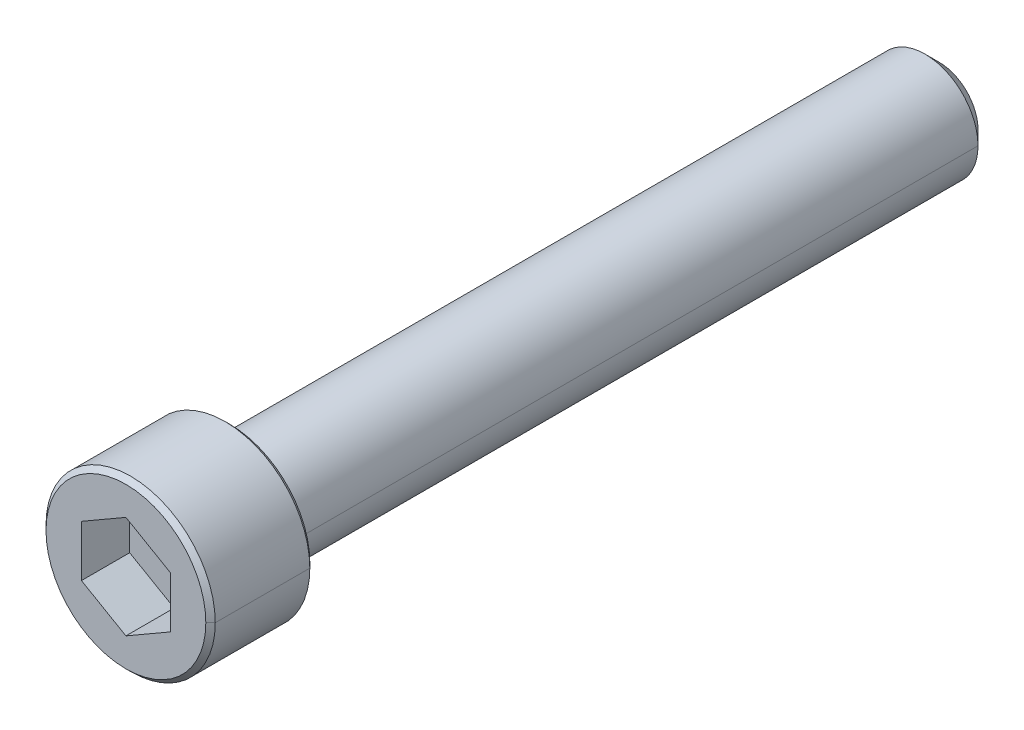
ISO-10303-21;
HEADER;
FILE_DESCRIPTION(('STEP AP214'),'2;1');
FILE_NAME('part.step','',(''),(''),'','','');
FILE_SCHEMA(('AUTOMOTIVE_DESIGN { 1 0 10303 214 1 1 1 1 }'));
ENDSEC;
DATA;
#1=APPLICATION_CONTEXT('core data for automotive mechanical design processes');
#2=APPLICATION_PROTOCOL_DEFINITION('international standard','automotive_design',2000,#1);
#3=PRODUCT_CONTEXT('',#1,'mechanical');
#4=PRODUCT('Part','Part','',(#3));
#5=PRODUCT_RELATED_PRODUCT_CATEGORY('part','',(#4));
#6=PRODUCT_DEFINITION_FORMATION('','',#4);
#7=PRODUCT_DEFINITION_CONTEXT('part definition',#1,'design');
#8=PRODUCT_DEFINITION('design','',#6,#7);
#9=PRODUCT_DEFINITION_SHAPE('','',#8);
#10=(LENGTH_UNIT() NAMED_UNIT(*) SI_UNIT(.MILLI.,.METRE.));
#11=(NAMED_UNIT(*) PLANE_ANGLE_UNIT() SI_UNIT($,.RADIAN.));
#12=(NAMED_UNIT(*) SI_UNIT($,.STERADIAN.) SOLID_ANGLE_UNIT());
#13=UNCERTAINTY_MEASURE_WITH_UNIT(LENGTH_MEASURE(1.E-05),#10,'distance_accuracy_value','');
#14=(GEOMETRIC_REPRESENTATION_CONTEXT(3) GLOBAL_UNCERTAINTY_ASSIGNED_CONTEXT((#13)) GLOBAL_UNIT_ASSIGNED_CONTEXT((#10,
#11,#12)) REPRESENTATION_CONTEXT('',''));
#15=CARTESIAN_POINT('',(0.,0.,0.));
#16=DIRECTION('',(0.,0.,1.));
#17=DIRECTION('',(1.,0.,0.));
#18=AXIS2_PLACEMENT_3D('',#15,#16,#17);
#19=CARTESIAN_POINT('',(0.,0.,0.));
#20=DIRECTION('',(0.,0.,-1.));
#21=DIRECTION('',(-1.,0.,0.));
#22=AXIS2_PLACEMENT_3D('',#19,#20,#21);
#23=PLANE('',#22);
#24=CARTESIAN_POINT('',(0.,0.,0.));
#25=DIRECTION('',(0.,0.,-1.));
#26=DIRECTION('',(-1.,0.,0.));
#27=AXIS2_PLACEMENT_3D('',#24,#25,#26);
#28=CIRCLE('',#27,2.1463);
#29=CARTESIAN_POINT('',(2.1463,0.,0.));
#30=VERTEX_POINT('',#29);
#31=CARTESIAN_POINT('',(-2.1463,0.,0.));
#32=VERTEX_POINT('',#31);
#33=EDGE_CURVE('E11',#30,#32,#28,.T.);
#34=ORIENTED_EDGE('',*,*,#33,.F.);
#35=CARTESIAN_POINT('',(0.,0.,0.));
#36=DIRECTION('',(0.,0.,-1.));
#37=DIRECTION('',(-1.,0.,0.));
#38=AXIS2_PLACEMENT_3D('',#35,#36,#37);
#39=CIRCLE('',#38,2.1463);
#40=EDGE_CURVE('E24',#32,#30,#39,.T.);
#41=ORIENTED_EDGE('',*,*,#40,.F.);
#42=EDGE_LOOP('',(#34,#41));
#43=FACE_BOUND('',#42,.T.);
#44=DIRECTION('',(0.866025403784434,-0.500000000000008,0.));
#45=VECTOR('',#44,1.);
#46=CARTESIAN_POINT('',(-1.1938,-0.689240751358565,0.));
#47=LINE('',#46,#45);
#48=CARTESIAN_POINT('',(-1.1938,-0.689240751358565,0.));
#49=VERTEX_POINT('',#48);
#50=CARTESIAN_POINT('',(0.,-1.37848150271715,0.));
#51=VERTEX_POINT('',#50);
#52=EDGE_CURVE('E303',#49,#51,#47,.T.);
#53=ORIENTED_EDGE('',*,*,#52,.F.);
#54=DIRECTION('',(0.,-1.,0.));
#55=VECTOR('',#54,1.);
#56=CARTESIAN_POINT('',(-1.1938,0.689240751358565,0.));
#57=LINE('',#56,#55);
#58=CARTESIAN_POINT('',(-1.1938,0.689240751358565,0.));
#59=VERTEX_POINT('',#58);
#60=EDGE_CURVE('E298',#59,#49,#57,.T.);
#61=ORIENTED_EDGE('',*,*,#60,.F.);
#62=DIRECTION('',(-0.866025403784434,-0.500000000000008,0.));
#63=VECTOR('',#62,1.);
#64=CARTESIAN_POINT('',(0.,1.37848150271715,0.));
#65=LINE('',#64,#63);
#66=CARTESIAN_POINT('',(0.,1.37848150271715,0.));
#67=VERTEX_POINT('',#66);
#68=EDGE_CURVE('E293',#67,#59,#65,.T.);
#69=ORIENTED_EDGE('',*,*,#68,.F.);
#70=DIRECTION('',(-0.866025403784434,0.500000000000008,0.));
#71=VECTOR('',#70,1.);
#72=CARTESIAN_POINT('',(1.1938,0.689240751358565,0.));
#73=LINE('',#72,#71);
#74=CARTESIAN_POINT('',(1.1938,0.689240751358565,0.));
#75=VERTEX_POINT('',#74);
#76=EDGE_CURVE('E288',#75,#67,#73,.T.);
#77=ORIENTED_EDGE('',*,*,#76,.F.);
#78=DIRECTION('',(0.,1.,0.));
#79=VECTOR('',#78,1.);
#80=CARTESIAN_POINT('',(1.1938,-0.689240751358565,0.));
#81=LINE('',#80,#79);
#82=CARTESIAN_POINT('',(1.1938,-0.689240751358565,0.));
#83=VERTEX_POINT('',#82);
#84=EDGE_CURVE('E283',#83,#75,#81,.T.);
#85=ORIENTED_EDGE('',*,*,#84,.F.);
#86=DIRECTION('',(0.866025403784434,0.500000000000008,0.));
#87=VECTOR('',#86,1.);
#88=CARTESIAN_POINT('',(0.,-1.37848150271715,0.));
#89=LINE('',#88,#87);
#90=EDGE_CURVE('E278',#51,#83,#89,.T.);
#91=ORIENTED_EDGE('',*,*,#90,.F.);
#92=EDGE_LOOP('',(#53,#61,#69,#77,#85,#91));
#93=FACE_BOUND('',#92,.T.);
#94=ADVANCED_FACE('F16',(#43,#93),#23,.F.);
#95=CARTESIAN_POINT('',(0.,-1.37848150271715,-1.2954));
#96=DIRECTION('',(0.500000000000008,-0.866025403784434,0.));
#97=DIRECTION('',(0.866025403784434,0.500000000000008,0.));
#98=AXIS2_PLACEMENT_3D('',#95,#96,#97);
#99=PLANE('',#98);
#100=ORIENTED_EDGE('',*,*,#90,.T.);
#101=DIRECTION('',(0.,0.,1.));
#102=VECTOR('',#101,1.);
#103=CARTESIAN_POINT('',(1.1938,-0.689240751358565,-1.2954));
#104=LINE('',#103,#102);
#105=CARTESIAN_POINT('',(1.1938,-0.689240751358565,-1.2954));
#106=VERTEX_POINT('',#105);
#107=EDGE_CURVE('E273',#106,#83,#104,.T.);
#108=ORIENTED_EDGE('',*,*,#107,.F.);
#109=DIRECTION('',(0.866025403784434,0.500000000000008,0.));
#110=VECTOR('',#109,1.);
#111=CARTESIAN_POINT('',(0.,-1.37848150271715,-1.2954));
#112=LINE('',#111,#110);
#113=CARTESIAN_POINT('',(0.,-1.37848150271715,-1.2954));
#114=VERTEX_POINT('',#113);
#115=EDGE_CURVE('E268',#114,#106,#112,.T.);
#116=ORIENTED_EDGE('',*,*,#115,.F.);
#117=DIRECTION('',(0.,0.,1.));
#118=VECTOR('',#117,1.);
#119=CARTESIAN_POINT('',(0.,-1.37848150271715,-1.2954));
#120=LINE('',#119,#118);
#121=EDGE_CURVE('E263',#114,#51,#120,.T.);
#122=ORIENTED_EDGE('',*,*,#121,.T.);
#123=EDGE_LOOP('',(#100,#108,#116,#122));
#124=FACE_BOUND('',#123,.T.);
#125=ADVANCED_FACE('F346',(#124),#99,.F.);
#126=CARTESIAN_POINT('',(-1.1938,-0.689240751358565,-1.2954));
#127=DIRECTION('',(-0.500000000000008,-0.866025403784434,0.));
#128=DIRECTION('',(0.866025403784434,-0.500000000000008,0.));
#129=AXIS2_PLACEMENT_3D('',#126,#127,#128);
#130=PLANE('',#129);
#131=ORIENTED_EDGE('',*,*,#52,.T.);
#132=ORIENTED_EDGE('',*,*,#121,.F.);
#133=DIRECTION('',(0.866025403784434,-0.500000000000008,0.));
#134=VECTOR('',#133,1.);
#135=CARTESIAN_POINT('',(-1.1938,-0.689240751358565,-1.2954));
#136=LINE('',#135,#134);
#137=CARTESIAN_POINT('',(-1.1938,-0.689240751358565,-1.2954));
#138=VERTEX_POINT('',#137);
#139=EDGE_CURVE('E258',#138,#114,#136,.T.);
#140=ORIENTED_EDGE('',*,*,#139,.F.);
#141=DIRECTION('',(0.,0.,1.));
#142=VECTOR('',#141,1.);
#143=CARTESIAN_POINT('',(-1.1938,-0.689240751358565,-1.2954));
#144=LINE('',#143,#142);
#145=EDGE_CURVE('E253',#138,#49,#144,.T.);
#146=ORIENTED_EDGE('',*,*,#145,.T.);
#147=EDGE_LOOP('',(#131,#132,#140,#146));
#148=FACE_BOUND('',#147,.T.);
#149=ADVANCED_FACE('F350',(#148),#130,.F.);
#150=CARTESIAN_POINT('',(-1.1938,0.689240751358565,-1.2954));
#151=DIRECTION('',(-1.,0.,0.));
#152=DIRECTION('',(0.,0.,1.));
#153=AXIS2_PLACEMENT_3D('',#150,#151,#152);
#154=PLANE('',#153);
#155=ORIENTED_EDGE('',*,*,#60,.T.);
#156=ORIENTED_EDGE('',*,*,#145,.F.);
#157=DIRECTION('',(0.,-1.,0.));
#158=VECTOR('',#157,1.);
#159=CARTESIAN_POINT('',(-1.1938,0.689240751358565,-1.2954));
#160=LINE('',#159,#158);
#161=CARTESIAN_POINT('',(-1.1938,0.689240751358565,-1.2954));
#162=VERTEX_POINT('',#161);
#163=EDGE_CURVE('E248',#162,#138,#160,.T.);
#164=ORIENTED_EDGE('',*,*,#163,.F.);
#165=DIRECTION('',(0.,0.,1.));
#166=VECTOR('',#165,1.);
#167=CARTESIAN_POINT('',(-1.1938,0.689240751358565,-1.2954));
#168=LINE('',#167,#166);
#169=EDGE_CURVE('E243',#162,#59,#168,.T.);
#170=ORIENTED_EDGE('',*,*,#169,.T.);
#171=EDGE_LOOP('',(#155,#156,#164,#170));
#172=FACE_BOUND('',#171,.T.);
#173=ADVANCED_FACE('F357',(#172),#154,.F.);
#174=CARTESIAN_POINT('',(0.,1.37848150271715,-1.2954));
#175=DIRECTION('',(-0.500000000000008,0.866025403784434,0.));
#176=DIRECTION('',(-0.866025403784434,-0.500000000000008,0.));
#177=AXIS2_PLACEMENT_3D('',#174,#175,#176);
#178=PLANE('',#177);
#179=ORIENTED_EDGE('',*,*,#68,.T.);
#180=ORIENTED_EDGE('',*,*,#169,.F.);
#181=DIRECTION('',(-0.866025403784434,-0.500000000000008,0.));
#182=VECTOR('',#181,1.);
#183=CARTESIAN_POINT('',(0.,1.37848150271715,-1.2954));
#184=LINE('',#183,#182);
#185=CARTESIAN_POINT('',(0.,1.37848150271715,-1.2954));
#186=VERTEX_POINT('',#185);
#187=EDGE_CURVE('E238',#186,#162,#184,.T.);
#188=ORIENTED_EDGE('',*,*,#187,.F.);
#189=DIRECTION('',(0.,0.,1.));
#190=VECTOR('',#189,1.);
#191=CARTESIAN_POINT('',(0.,1.37848150271715,-1.2954));
#192=LINE('',#191,#190);
#193=EDGE_CURVE('E233',#186,#67,#192,.T.);
#194=ORIENTED_EDGE('',*,*,#193,.T.);
#195=EDGE_LOOP('',(#179,#180,#188,#194));
#196=FACE_BOUND('',#195,.T.);
#197=ADVANCED_FACE('F360',(#196),#178,.F.);
#198=CARTESIAN_POINT('',(1.1938,0.689240751358565,-1.2954));
#199=DIRECTION('',(0.500000000000008,0.866025403784434,0.));
#200=DIRECTION('',(-0.866025403784434,0.500000000000008,0.));
#201=AXIS2_PLACEMENT_3D('',#198,#199,#200);
#202=PLANE('',#201);
#203=ORIENTED_EDGE('',*,*,#76,.T.);
#204=ORIENTED_EDGE('',*,*,#193,.F.);
#205=DIRECTION('',(-0.866025403784434,0.500000000000008,0.));
#206=VECTOR('',#205,1.);
#207=CARTESIAN_POINT('',(1.1938,0.689240751358565,-1.2954));
#208=LINE('',#207,#206);
#209=CARTESIAN_POINT('',(1.1938,0.689240751358565,-1.2954));
#210=VERTEX_POINT('',#209);
#211=EDGE_CURVE('E228',#210,#186,#208,.T.);
#212=ORIENTED_EDGE('',*,*,#211,.F.);
#213=DIRECTION('',(0.,0.,1.));
#214=VECTOR('',#213,1.);
#215=CARTESIAN_POINT('',(1.1938,0.689240751358565,-1.2954));
#216=LINE('',#215,#214);
#217=EDGE_CURVE('E223',#210,#75,#216,.T.);
#218=ORIENTED_EDGE('',*,*,#217,.T.);
#219=EDGE_LOOP('',(#203,#204,#212,#218));
#220=FACE_BOUND('',#219,.T.);
#221=ADVANCED_FACE('F364',(#220),#202,.F.);
#222=CARTESIAN_POINT('',(1.1938,-0.689240751358565,-1.2954));
#223=DIRECTION('',(1.,0.,0.));
#224=DIRECTION('',(0.,0.,-1.));
#225=AXIS2_PLACEMENT_3D('',#222,#223,#224);
#226=PLANE('',#225);
#227=ORIENTED_EDGE('',*,*,#84,.T.);
#228=ORIENTED_EDGE('',*,*,#217,.F.);
#229=DIRECTION('',(0.,1.,0.));
#230=VECTOR('',#229,1.);
#231=CARTESIAN_POINT('',(1.1938,-0.689240751358565,-1.2954));
#232=LINE('',#231,#230);
#233=EDGE_CURVE('E218',#106,#210,#232,.T.);
#234=ORIENTED_EDGE('',*,*,#233,.F.);
#235=ORIENTED_EDGE('',*,*,#107,.T.);
#236=EDGE_LOOP('',(#227,#228,#234,#235));
#237=FACE_BOUND('',#236,.T.);
#238=ADVANCED_FACE('F367',(#237),#226,.F.);
#239=CARTESIAN_POINT('',(0.,0.,-1.2954));
#240=DIRECTION('',(0.,0.,1.));
#241=DIRECTION('',(1.,0.,0.));
#242=AXIS2_PLACEMENT_3D('',#239,#240,#241);
#243=PLANE('',#242);
#244=ORIENTED_EDGE('',*,*,#163,.T.);
#245=ORIENTED_EDGE('',*,*,#139,.T.);
#246=ORIENTED_EDGE('',*,*,#115,.T.);
#247=ORIENTED_EDGE('',*,*,#233,.T.);
#248=ORIENTED_EDGE('',*,*,#211,.T.);
#249=ORIENTED_EDGE('',*,*,#187,.T.);
#250=EDGE_LOOP('',(#244,#245,#246,#247,#248,#249));
#251=FACE_BOUND('',#250,.T.);
#252=ADVANCED_FACE('F369',(#251),#243,.T.);
#253=CARTESIAN_POINT('',(0.,0.,0.));
#254=DIRECTION('',(0.,0.,-1.));
#255=DIRECTION('',(0.,-1.,0.));
#256=AXIS2_PLACEMENT_3D('',#253,#254,#255);
#257=CONICAL_SURFACE('',#256,2.1463,0.785398163397453);
#258=DIRECTION('',(0.707106781186551,0.,-0.707106781186544));
#259=VECTOR('',#258,1.);
#260=CARTESIAN_POINT('',(2.1463,0.,0.));
#261=LINE('',#260,#259);
#262=CARTESIAN_POINT('',(2.2733,0.,-0.126999999999998));
#263=VERTEX_POINT('',#262);
#264=EDGE_CURVE('E214',#30,#263,#261,.T.);
#265=ORIENTED_EDGE('',*,*,#264,.T.);
#266=CARTESIAN_POINT('',(0.,0.,-0.126999999999999));
#267=DIRECTION('',(0.,0.,-1.));
#268=DIRECTION('',(-1.,0.,0.));
#269=AXIS2_PLACEMENT_3D('',#266,#267,#268);
#270=CIRCLE('',#269,2.2733);
#271=CARTESIAN_POINT('',(-2.2733,0.,-0.126999999999999));
#272=VERTEX_POINT('',#271);
#273=EDGE_CURVE('E209',#272,#263,#270,.T.);
#274=ORIENTED_EDGE('',*,*,#273,.F.);
#275=DIRECTION('',(-0.707106781186551,0.,-0.707106781186544));
#276=VECTOR('',#275,1.);
#277=CARTESIAN_POINT('',(-2.1463,0.,0.));
#278=LINE('',#277,#276);
#279=EDGE_CURVE('E204',#32,#272,#278,.T.);
#280=ORIENTED_EDGE('',*,*,#279,.F.);
#281=ORIENTED_EDGE('',*,*,#40,.T.);
#282=EDGE_LOOP('',(#265,#274,#280,#281));
#283=FACE_BOUND('',#282,.T.);
#284=ADVANCED_FACE('F313',(#283),#257,.T.);
#285=CARTESIAN_POINT('',(0.,0.,0.));
#286=DIRECTION('',(0.,0.,-1.));
#287=DIRECTION('',(0.,1.,0.));
#288=AXIS2_PLACEMENT_3D('',#285,#286,#287);
#289=CONICAL_SURFACE('',#288,2.1463,0.785398163397453);
#290=ORIENTED_EDGE('',*,*,#264,.F.);
#291=ORIENTED_EDGE('',*,*,#33,.T.);
#292=ORIENTED_EDGE('',*,*,#279,.T.);
#293=CARTESIAN_POINT('',(0.,0.,-0.126999999999999));
#294=DIRECTION('',(0.,0.,-1.));
#295=DIRECTION('',(-1.,0.,0.));
#296=AXIS2_PLACEMENT_3D('',#293,#294,#295);
#297=CIRCLE('',#296,2.2733);
#298=EDGE_CURVE('E199',#263,#272,#297,.T.);
#299=ORIENTED_EDGE('',*,*,#298,.F.);
#300=EDGE_LOOP('',(#290,#291,#292,#299));
#301=FACE_BOUND('',#300,.T.);
#302=ADVANCED_FACE('F316',(#301),#289,.T.);
#303=CARTESIAN_POINT('',(0.,0.,-21.844));
#304=DIRECTION('',(0.,0.,-1.));
#305=DIRECTION('',(0.,1.,0.));
#306=AXIS2_PLACEMENT_3D('',#303,#304,#305);
#307=CYLINDRICAL_SURFACE('',#306,2.2733);
#308=DIRECTION('',(0.,0.,-1.));
#309=VECTOR('',#308,1.);
#310=CARTESIAN_POINT('',(2.2733,0.,-0.126999999999999));
#311=LINE('',#310,#309);
#312=CARTESIAN_POINT('',(2.2733,0.,-2.667));
#313=VERTEX_POINT('',#312);
#314=EDGE_CURVE('E194',#263,#313,#311,.T.);
#315=ORIENTED_EDGE('',*,*,#314,.F.);
#316=ORIENTED_EDGE('',*,*,#298,.T.);
#317=DIRECTION('',(0.,0.,-1.));
#318=VECTOR('',#317,1.);
#319=CARTESIAN_POINT('',(-2.2733,0.,-0.126999999999999));
#320=LINE('',#319,#318);
#321=CARTESIAN_POINT('',(-2.2733,0.,-2.667));
#322=VERTEX_POINT('',#321);
#323=EDGE_CURVE('E190',#272,#322,#320,.T.);
#324=ORIENTED_EDGE('',*,*,#323,.T.);
#325=CARTESIAN_POINT('',(0.,0.,-2.667));
#326=DIRECTION('',(0.,0.,-1.));
#327=DIRECTION('',(-1.,0.,0.));
#328=AXIS2_PLACEMENT_3D('',#325,#326,#327);
#329=CIRCLE('',#328,2.2733);
#330=EDGE_CURVE('E185',#313,#322,#329,.T.);
#331=ORIENTED_EDGE('',*,*,#330,.F.);
#332=EDGE_LOOP('',(#315,#316,#324,#331));
#333=FACE_BOUND('',#332,.T.);
#334=ADVANCED_FACE('F320',(#333),#307,.T.);
#335=CARTESIAN_POINT('',(0.,0.,-2.667));
#336=DIRECTION('',(0.,0.,1.));
#337=DIRECTION('',(0.,1.,0.));
#338=AXIS2_PLACEMENT_3D('',#335,#336,#337);
#339=CONICAL_SURFACE('',#338,2.2733,0.78539816339744);
#340=DIRECTION('',(-0.707106781186541,0.,0.707106781186554));
#341=VECTOR('',#340,1.);
#342=CARTESIAN_POINT('',(-2.1463,0.,-2.794));
#343=LINE('',#342,#341);
#344=CARTESIAN_POINT('',(-2.1463,0.,-2.794));
#345=VERTEX_POINT('',#344);
#346=EDGE_CURVE('E180',#345,#322,#343,.T.);
#347=ORIENTED_EDGE('',*,*,#346,.F.);
#348=CARTESIAN_POINT('',(0.,0.,-2.794));
#349=DIRECTION('',(0.,0.,-1.));
#350=DIRECTION('',(-1.,0.,0.));
#351=AXIS2_PLACEMENT_3D('',#348,#349,#350);
#352=CIRCLE('',#351,2.1463);
#353=CARTESIAN_POINT('',(2.1463,0.,-2.794));
#354=VERTEX_POINT('',#353);
#355=EDGE_CURVE('E175',#354,#345,#352,.T.);
#356=ORIENTED_EDGE('',*,*,#355,.F.);
#357=DIRECTION('',(0.707106781186541,0.,0.707106781186554));
#358=VECTOR('',#357,1.);
#359=CARTESIAN_POINT('',(2.1463,0.,-2.794));
#360=LINE('',#359,#358);
#361=EDGE_CURVE('E170',#354,#313,#360,.T.);
#362=ORIENTED_EDGE('',*,*,#361,.T.);
#363=ORIENTED_EDGE('',*,*,#330,.T.);
#364=EDGE_LOOP('',(#347,#356,#362,#363));
#365=FACE_BOUND('',#364,.T.);
#366=ADVANCED_FACE('F329',(#365),#339,.T.);
#367=CARTESIAN_POINT('',(0.,0.,-2.667));
#368=DIRECTION('',(0.,0.,1.));
#369=DIRECTION('',(0.,-1.,0.));
#370=AXIS2_PLACEMENT_3D('',#367,#368,#369);
#371=CONICAL_SURFACE('',#370,2.2733,0.78539816339744);
#372=ORIENTED_EDGE('',*,*,#346,.T.);
#373=CARTESIAN_POINT('',(0.,0.,-2.667));
#374=DIRECTION('',(0.,0.,-1.));
#375=DIRECTION('',(-1.,0.,0.));
#376=AXIS2_PLACEMENT_3D('',#373,#374,#375);
#377=CIRCLE('',#376,2.2733);
#378=EDGE_CURVE('E165',#322,#313,#377,.T.);
#379=ORIENTED_EDGE('',*,*,#378,.T.);
#380=ORIENTED_EDGE('',*,*,#361,.F.);
#381=CARTESIAN_POINT('',(0.,0.,-2.794));
#382=DIRECTION('',(0.,0.,-1.));
#383=DIRECTION('',(-1.,0.,0.));
#384=AXIS2_PLACEMENT_3D('',#381,#382,#383);
#385=CIRCLE('',#384,2.1463);
#386=EDGE_CURVE('E160',#345,#354,#385,.T.);
#387=ORIENTED_EDGE('',*,*,#386,.F.);
#388=EDGE_LOOP('',(#372,#379,#380,#387));
#389=FACE_BOUND('',#388,.T.);
#390=ADVANCED_FACE('F327',(#389),#371,.T.);
#391=CARTESIAN_POINT('',(0.,2.1463,-2.794));
#392=DIRECTION('',(0.,0.,1.));
#393=DIRECTION('',(1.,0.,0.));
#394=AXIS2_PLACEMENT_3D('',#391,#392,#393);
#395=PLANE('',#394);
#396=CARTESIAN_POINT('',(0.,0.,-2.794));
#397=DIRECTION('',(0.,0.,-1.));
#398=DIRECTION('',(-1.,0.,0.));
#399=AXIS2_PLACEMENT_3D('',#396,#397,#398);
#400=CIRCLE('',#399,1.4224);
#401=CARTESIAN_POINT('',(1.4224,0.,-2.79399999999999));
#402=VERTEX_POINT('',#401);
#403=CARTESIAN_POINT('',(-1.4224,0.,-2.794));
#404=VERTEX_POINT('',#403);
#405=EDGE_CURVE('E155',#402,#404,#400,.T.);
#406=ORIENTED_EDGE('',*,*,#405,.F.);
#407=CARTESIAN_POINT('',(0.,0.,-2.794));
#408=DIRECTION('',(0.,0.,-1.));
#409=DIRECTION('',(-1.,0.,0.));
#410=AXIS2_PLACEMENT_3D('',#407,#408,#409);
#411=CIRCLE('',#410,1.4224);
#412=EDGE_CURVE('E150',#404,#402,#411,.T.);
#413=ORIENTED_EDGE('',*,*,#412,.F.);
#414=EDGE_LOOP('',(#406,#413));
#415=FACE_BOUND('',#414,.T.);
#416=ORIENTED_EDGE('',*,*,#386,.T.);
#417=ORIENTED_EDGE('',*,*,#355,.T.);
#418=EDGE_LOOP('',(#416,#417));
#419=FACE_BOUND('',#418,.T.);
#420=ADVANCED_FACE('F331',(#415,#419),#395,.F.);
#421=CARTESIAN_POINT('',(0.,0.,-21.844));
#422=DIRECTION('',(0.,0.,-1.));
#423=DIRECTION('',(0.,-1.,0.));
#424=AXIS2_PLACEMENT_3D('',#421,#422,#423);
#425=CYLINDRICAL_SURFACE('',#424,1.4224);
#426=DIRECTION('',(0.,0.,-1.));
#427=VECTOR('',#426,1.);
#428=CARTESIAN_POINT('',(1.4224,0.,-2.79399999999999));
#429=LINE('',#428,#427);
#430=CARTESIAN_POINT('',(1.4224,0.,-21.46554));
#431=VERTEX_POINT('',#430);
#432=EDGE_CURVE('E146',#402,#431,#429,.T.);
#433=ORIENTED_EDGE('',*,*,#432,.T.);
#434=CARTESIAN_POINT('',(0.,0.,-21.46554));
#435=DIRECTION('',(0.,0.,-1.));
#436=DIRECTION('',(-1.,0.,0.));
#437=AXIS2_PLACEMENT_3D('',#434,#435,#436);
#438=CIRCLE('',#437,1.4224);
#439=CARTESIAN_POINT('',(-1.4224,0.,-21.46554));
#440=VERTEX_POINT('',#439);
#441=EDGE_CURVE('E124',#440,#431,#438,.T.);
#442=ORIENTED_EDGE('',*,*,#441,.F.);
#443=DIRECTION('',(0.,0.,-1.));
#444=VECTOR('',#443,1.);
#445=CARTESIAN_POINT('',(-1.4224,0.,-2.794));
#446=LINE('',#445,#444);
#447=EDGE_CURVE('E138',#404,#440,#446,.T.);
#448=ORIENTED_EDGE('',*,*,#447,.F.);
#449=ORIENTED_EDGE('',*,*,#412,.T.);
#450=EDGE_LOOP('',(#433,#442,#448,#449));
#451=FACE_BOUND('',#450,.T.);
#452=ADVANCED_FACE('F333',(#451),#425,.T.);
#453=CARTESIAN_POINT('',(0.,0.,-21.844));
#454=DIRECTION('',(0.,0.,-1.));
#455=DIRECTION('',(0.,1.,0.));
#456=AXIS2_PLACEMENT_3D('',#453,#454,#455);
#457=CYLINDRICAL_SURFACE('',#456,1.4224);
#458=ORIENTED_EDGE('',*,*,#432,.F.);
#459=ORIENTED_EDGE('',*,*,#405,.T.);
#460=ORIENTED_EDGE('',*,*,#447,.T.);
#461=CARTESIAN_POINT('',(0.,0.,-21.46554));
#462=DIRECTION('',(0.,0.,-1.));
#463=DIRECTION('',(-1.,0.,0.));
#464=AXIS2_PLACEMENT_3D('',#461,#462,#463);
#465=CIRCLE('',#464,1.4224);
#466=EDGE_CURVE('E134',#431,#440,#465,.T.);
#467=ORIENTED_EDGE('',*,*,#466,.F.);
#468=EDGE_LOOP('',(#458,#459,#460,#467));
#469=FACE_BOUND('',#468,.T.);
#470=ADVANCED_FACE('F341',(#469),#457,.T.);
#471=CARTESIAN_POINT('',(0.,0.,-21.46554));
#472=DIRECTION('',(0.,0.,1.));
#473=DIRECTION('',(0.,1.,0.));
#474=AXIS2_PLACEMENT_3D('',#471,#472,#473);
#475=CONICAL_SURFACE('',#474,1.4224,0.785398163397448);
#476=DIRECTION('',(-0.707106781186546,0.,0.70710678118655));
#477=VECTOR('',#476,1.);
#478=CARTESIAN_POINT('',(-1.04394,0.,-21.844));
#479=LINE('',#478,#477);
#480=CARTESIAN_POINT('',(-1.04394,0.,-21.844));
#481=VERTEX_POINT('',#480);
#482=EDGE_CURVE('E115',#481,#440,#479,.T.);
#483=ORIENTED_EDGE('',*,*,#482,.F.);
#484=CARTESIAN_POINT('',(0.,0.,-21.844));
#485=DIRECTION('',(0.,0.,-1.));
#486=DIRECTION('',(-1.,0.,0.));
#487=AXIS2_PLACEMENT_3D('',#484,#485,#486);
#488=CIRCLE('',#487,1.04394);
#489=CARTESIAN_POINT('',(1.04394,0.,-21.844));
#490=VERTEX_POINT('',#489);
#491=EDGE_CURVE('E107',#490,#481,#488,.T.);
#492=ORIENTED_EDGE('',*,*,#491,.F.);
#493=DIRECTION('',(0.707106781186546,0.,0.70710678118655));
#494=VECTOR('',#493,1.);
#495=CARTESIAN_POINT('',(1.04394,0.,-21.844));
#496=LINE('',#495,#494);
#497=EDGE_CURVE('E112',#490,#431,#496,.T.);
#498=ORIENTED_EDGE('',*,*,#497,.T.);
#499=ORIENTED_EDGE('',*,*,#466,.T.);
#500=EDGE_LOOP('',(#483,#492,#498,#499));
#501=FACE_BOUND('',#500,.T.);
#502=ADVANCED_FACE('F109',(#501),#475,.T.);
#503=CARTESIAN_POINT('',(0.,0.,-21.46554));
#504=DIRECTION('',(0.,0.,1.));
#505=DIRECTION('',(0.,-1.,0.));
#506=AXIS2_PLACEMENT_3D('',#503,#504,#505);
#507=CONICAL_SURFACE('',#506,1.4224,0.785398163397448);
#508=ORIENTED_EDGE('',*,*,#482,.T.);
#509=ORIENTED_EDGE('',*,*,#441,.T.);
#510=ORIENTED_EDGE('',*,*,#497,.F.);
#511=CARTESIAN_POINT('',(0.,0.,-21.844));
#512=DIRECTION('',(0.,0.,-1.));
#513=DIRECTION('',(-1.,0.,0.));
#514=AXIS2_PLACEMENT_3D('',#511,#512,#513);
#515=CIRCLE('',#514,1.04394);
#516=EDGE_CURVE('E119',#481,#490,#515,.T.);
#517=ORIENTED_EDGE('',*,*,#516,.F.);
#518=EDGE_LOOP('',(#508,#509,#510,#517));
#519=FACE_BOUND('',#518,.T.);
#520=ADVANCED_FACE('F123',(#519),#507,.T.);
#521=CARTESIAN_POINT('',(0.,1.04394,-21.844));
#522=DIRECTION('',(0.,0.,1.));
#523=DIRECTION('',(1.,0.,0.));
#524=AXIS2_PLACEMENT_3D('',#521,#522,#523);
#525=PLANE('',#524);
#526=ORIENTED_EDGE('',*,*,#516,.T.);
#527=ORIENTED_EDGE('',*,*,#491,.T.);
#528=EDGE_LOOP('',(#526,#527));
#529=FACE_BOUND('',#528,.T.);
#530=ADVANCED_FACE('F120',(#529),#525,.F.);
#531=CARTESIAN_POINT('',(0.,0.,-21.844));
#532=DIRECTION('',(0.,0.,-1.));
#533=DIRECTION('',(0.,-1.,0.));
#534=AXIS2_PLACEMENT_3D('',#531,#532,#533);
#535=CYLINDRICAL_SURFACE('',#534,2.2733);
#536=ORIENTED_EDGE('',*,*,#314,.T.);
#537=ORIENTED_EDGE('',*,*,#378,.F.);
#538=ORIENTED_EDGE('',*,*,#323,.F.);
#539=ORIENTED_EDGE('',*,*,#273,.T.);
#540=EDGE_LOOP('',(#536,#537,#538,#539));
#541=FACE_BOUND('',#540,.T.);
#542=ADVANCED_FACE('F323',(#541),#535,.T.);
#543=CLOSED_SHELL('',(#94,#125,#149,#173,#197,#221,#238,#252,#284,#302,#334,#366,#390,#420,#452,
#470,#502,#520,#530,#542));
#544=MANIFOLD_SOLID_BREP('B1',#543);
#545=ADVANCED_BREP_SHAPE_REPRESENTATION('',(#18,#544),#14);
#546=SHAPE_DEFINITION_REPRESENTATION(#9,#545);
ENDSEC;
END-ISO-10303-21;
